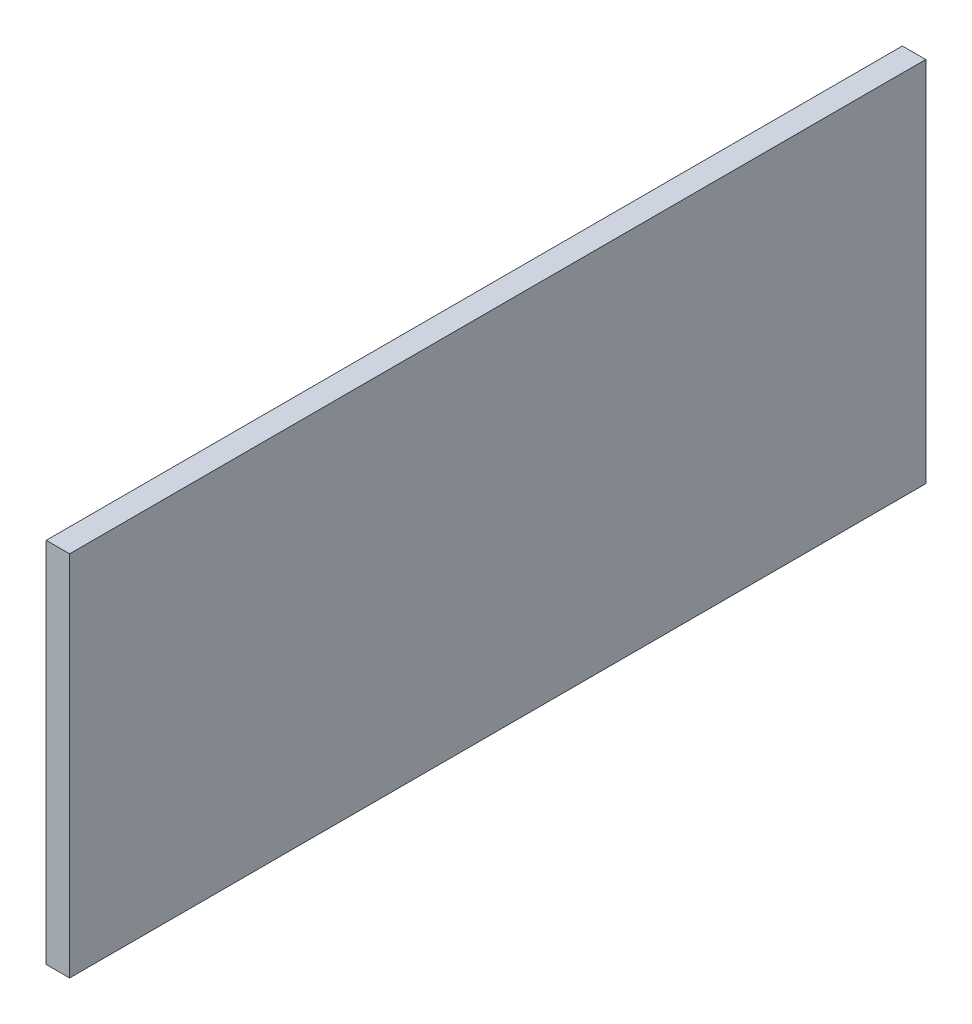
ISO-10303-21;
HEADER;
FILE_DESCRIPTION(('STEP AP214'),'2;1');
FILE_NAME('part.step','',(''),(''),'','','');
FILE_SCHEMA(('AUTOMOTIVE_DESIGN { 1 0 10303 214 1 1 1 1 }'));
ENDSEC;
DATA;
#1=APPLICATION_CONTEXT('core data for automotive mechanical design processes');
#2=APPLICATION_PROTOCOL_DEFINITION('international standard','automotive_design',2000,#1);
#3=PRODUCT_CONTEXT('',#1,'mechanical');
#4=PRODUCT('Part','Part','',(#3));
#5=PRODUCT_RELATED_PRODUCT_CATEGORY('part','',(#4));
#6=PRODUCT_DEFINITION_FORMATION('','',#4);
#7=PRODUCT_DEFINITION_CONTEXT('part definition',#1,'design');
#8=PRODUCT_DEFINITION('design','',#6,#7);
#9=PRODUCT_DEFINITION_SHAPE('','',#8);
#10=(LENGTH_UNIT() NAMED_UNIT(*) SI_UNIT(.MILLI.,.METRE.));
#11=(NAMED_UNIT(*) PLANE_ANGLE_UNIT() SI_UNIT($,.RADIAN.));
#12=(NAMED_UNIT(*) SI_UNIT($,.STERADIAN.) SOLID_ANGLE_UNIT());
#13=UNCERTAINTY_MEASURE_WITH_UNIT(LENGTH_MEASURE(1.E-05),#10,'distance_accuracy_value','');
#14=(GEOMETRIC_REPRESENTATION_CONTEXT(3) GLOBAL_UNCERTAINTY_ASSIGNED_CONTEXT((#13)) GLOBAL_UNIT_ASSIGNED_CONTEXT((#10,
#11,#12)) REPRESENTATION_CONTEXT('',''));
#15=CARTESIAN_POINT('',(0.,0.,0.));
#16=DIRECTION('',(0.,0.,1.));
#17=DIRECTION('',(1.,0.,0.));
#18=AXIS2_PLACEMENT_3D('',#15,#16,#17);
#19=CARTESIAN_POINT('',(3.175,-49.85004,232.34904));
#20=DIRECTION('',(-1.,0.,0.));
#21=DIRECTION('',(0.,0.,1.));
#22=AXIS2_PLACEMENT_3D('',#19,#20,#21);
#23=PLANE('',#22);
#24=DIRECTION('',(0.,1.,0.));
#25=VECTOR('',#24,1.);
#26=CARTESIAN_POINT('',(3.175,-49.85004,0.));
#27=LINE('',#26,#25);
#28=CARTESIAN_POINT('',(3.175,-49.85004,0.));
#29=VERTEX_POINT('',#28);
#30=CARTESIAN_POINT('',(3.175,49.85004,0.));
#31=VERTEX_POINT('',#30);
#32=EDGE_CURVE('E102',#29,#31,#27,.T.);
#33=ORIENTED_EDGE('',*,*,#32,.T.);
#34=DIRECTION('',(0.,0.,-1.));
#35=VECTOR('',#34,1.);
#36=CARTESIAN_POINT('',(3.175,49.85004,232.34904));
#37=LINE('',#36,#35);
#38=CARTESIAN_POINT('',(3.175,49.85004,232.34904));
#39=VERTEX_POINT('',#38);
#40=EDGE_CURVE('E11',#39,#31,#37,.T.);
#41=ORIENTED_EDGE('',*,*,#40,.F.);
#42=DIRECTION('',(0.,1.,0.));
#43=VECTOR('',#42,1.);
#44=CARTESIAN_POINT('',(3.175,-49.85004,232.34904));
#45=LINE('',#44,#43);
#46=CARTESIAN_POINT('',(3.175,-49.85004,232.34904));
#47=VERTEX_POINT('',#46);
#48=EDGE_CURVE('E90',#47,#39,#45,.T.);
#49=ORIENTED_EDGE('',*,*,#48,.F.);
#50=DIRECTION('',(0.,0.,-1.));
#51=VECTOR('',#50,1.);
#52=CARTESIAN_POINT('',(3.175,-49.85004,232.34904));
#53=LINE('',#52,#51);
#54=EDGE_CURVE('E98',#47,#29,#53,.T.);
#55=ORIENTED_EDGE('',*,*,#54,.T.);
#56=EDGE_LOOP('',(#33,#41,#49,#55));
#57=FACE_BOUND('',#56,.T.);
#58=ADVANCED_FACE('F39',(#57),#23,.F.);
#59=CARTESIAN_POINT('',(-3.175,49.85004,232.34904));
#60=DIRECTION('',(0.,-1.,0.));
#61=DIRECTION('',(0.,0.,-1.));
#62=AXIS2_PLACEMENT_3D('',#59,#60,#61);
#63=PLANE('',#62);
#64=DIRECTION('',(-1.,0.,0.));
#65=VECTOR('',#64,1.);
#66=CARTESIAN_POINT('',(-3.175,49.85004,0.));
#67=LINE('',#66,#65);
#68=CARTESIAN_POINT('',(-3.175,49.85004,0.));
#69=VERTEX_POINT('',#68);
#70=EDGE_CURVE('E94',#31,#69,#67,.T.);
#71=ORIENTED_EDGE('',*,*,#70,.T.);
#72=DIRECTION('',(0.,0.,-1.));
#73=VECTOR('',#72,1.);
#74=CARTESIAN_POINT('',(-3.175,49.85004,232.34904));
#75=LINE('',#74,#73);
#76=CARTESIAN_POINT('',(-3.175,49.85004,232.34904));
#77=VERTEX_POINT('',#76);
#78=EDGE_CURVE('E47',#77,#69,#75,.T.);
#79=ORIENTED_EDGE('',*,*,#78,.F.);
#80=DIRECTION('',(-1.,0.,0.));
#81=VECTOR('',#80,1.);
#82=CARTESIAN_POINT('',(-3.175,49.85004,232.34904));
#83=LINE('',#82,#81);
#84=EDGE_CURVE('E85',#39,#77,#83,.T.);
#85=ORIENTED_EDGE('',*,*,#84,.F.);
#86=ORIENTED_EDGE('',*,*,#40,.T.);
#87=EDGE_LOOP('',(#71,#79,#85,#86));
#88=FACE_BOUND('',#87,.T.);
#89=ADVANCED_FACE('F93',(#88),#63,.F.);
#90=CARTESIAN_POINT('',(-3.175,-49.85004,232.34904));
#91=DIRECTION('',(1.,0.,0.));
#92=DIRECTION('',(0.,0.,-1.));
#93=AXIS2_PLACEMENT_3D('',#90,#91,#92);
#94=PLANE('',#93);
#95=DIRECTION('',(0.,-1.,0.));
#96=VECTOR('',#95,1.);
#97=CARTESIAN_POINT('',(-3.175,-49.85004,0.));
#98=LINE('',#97,#96);
#99=CARTESIAN_POINT('',(-3.175,-49.85004,0.));
#100=VERTEX_POINT('',#99);
#101=EDGE_CURVE('E72',#69,#100,#98,.T.);
#102=ORIENTED_EDGE('',*,*,#101,.T.);
#103=DIRECTION('',(0.,0.,-1.));
#104=VECTOR('',#103,1.);
#105=CARTESIAN_POINT('',(-3.175,-49.85004,232.34904));
#106=LINE('',#105,#104);
#107=CARTESIAN_POINT('',(-3.175,-49.85004,232.34904));
#108=VERTEX_POINT('',#107);
#109=EDGE_CURVE('E95',#108,#100,#106,.T.);
#110=ORIENTED_EDGE('',*,*,#109,.F.);
#111=DIRECTION('',(0.,-1.,0.));
#112=VECTOR('',#111,1.);
#113=CARTESIAN_POINT('',(-3.175,-49.85004,232.34904));
#114=LINE('',#113,#112);
#115=EDGE_CURVE('E88',#77,#108,#114,.T.);
#116=ORIENTED_EDGE('',*,*,#115,.F.);
#117=ORIENTED_EDGE('',*,*,#78,.T.);
#118=EDGE_LOOP('',(#102,#110,#116,#117));
#119=FACE_BOUND('',#118,.T.);
#120=ADVANCED_FACE('F96',(#119),#94,.F.);
#121=CARTESIAN_POINT('',(-3.175,-49.85004,232.34904));
#122=DIRECTION('',(0.,1.,0.));
#123=DIRECTION('',(0.,0.,1.));
#124=AXIS2_PLACEMENT_3D('',#121,#122,#123);
#125=PLANE('',#124);
#126=DIRECTION('',(1.,0.,0.));
#127=VECTOR('',#126,1.);
#128=CARTESIAN_POINT('',(-3.175,-49.85004,0.));
#129=LINE('',#128,#127);
#130=EDGE_CURVE('E78',#100,#29,#129,.T.);
#131=ORIENTED_EDGE('',*,*,#130,.T.);
#132=ORIENTED_EDGE('',*,*,#54,.F.);
#133=DIRECTION('',(1.,0.,0.));
#134=VECTOR('',#133,1.);
#135=CARTESIAN_POINT('',(-3.175,-49.85004,232.34904));
#136=LINE('',#135,#134);
#137=EDGE_CURVE('E55',#108,#47,#136,.T.);
#138=ORIENTED_EDGE('',*,*,#137,.F.);
#139=ORIENTED_EDGE('',*,*,#109,.T.);
#140=EDGE_LOOP('',(#131,#132,#138,#139));
#141=FACE_BOUND('',#140,.T.);
#142=ADVANCED_FACE('F109',(#141),#125,.F.);
#143=CARTESIAN_POINT('',(0.,0.,232.34904));
#144=DIRECTION('',(0.,0.,-1.));
#145=DIRECTION('',(-1.,0.,0.));
#146=AXIS2_PLACEMENT_3D('',#143,#144,#145);
#147=PLANE('',#146);
#148=ORIENTED_EDGE('',*,*,#48,.T.);
#149=ORIENTED_EDGE('',*,*,#84,.T.);
#150=ORIENTED_EDGE('',*,*,#115,.T.);
#151=ORIENTED_EDGE('',*,*,#137,.T.);
#152=EDGE_LOOP('',(#148,#149,#150,#151));
#153=FACE_BOUND('',#152,.T.);
#154=ADVANCED_FACE('F86',(#153),#147,.F.);
#155=CARTESIAN_POINT('',(0.,0.,0.));
#156=DIRECTION('',(0.,0.,-1.));
#157=DIRECTION('',(-1.,0.,0.));
#158=AXIS2_PLACEMENT_3D('',#155,#156,#157);
#159=PLANE('',#158);
#160=ORIENTED_EDGE('',*,*,#32,.F.);
#161=ORIENTED_EDGE('',*,*,#130,.F.);
#162=ORIENTED_EDGE('',*,*,#101,.F.);
#163=ORIENTED_EDGE('',*,*,#70,.F.);
#164=EDGE_LOOP('',(#160,#161,#162,#163));
#165=FACE_BOUND('',#164,.T.);
#166=ADVANCED_FACE('F112',(#165),#159,.T.);
#167=CLOSED_SHELL('',(#58,#89,#120,#142,#154,#166));
#168=MANIFOLD_SOLID_BREP('B2',#167);
#169=ADVANCED_BREP_SHAPE_REPRESENTATION('',(#18,#168),#14);
#170=SHAPE_DEFINITION_REPRESENTATION(#9,#169);
ENDSEC;
END-ISO-10303-21;
